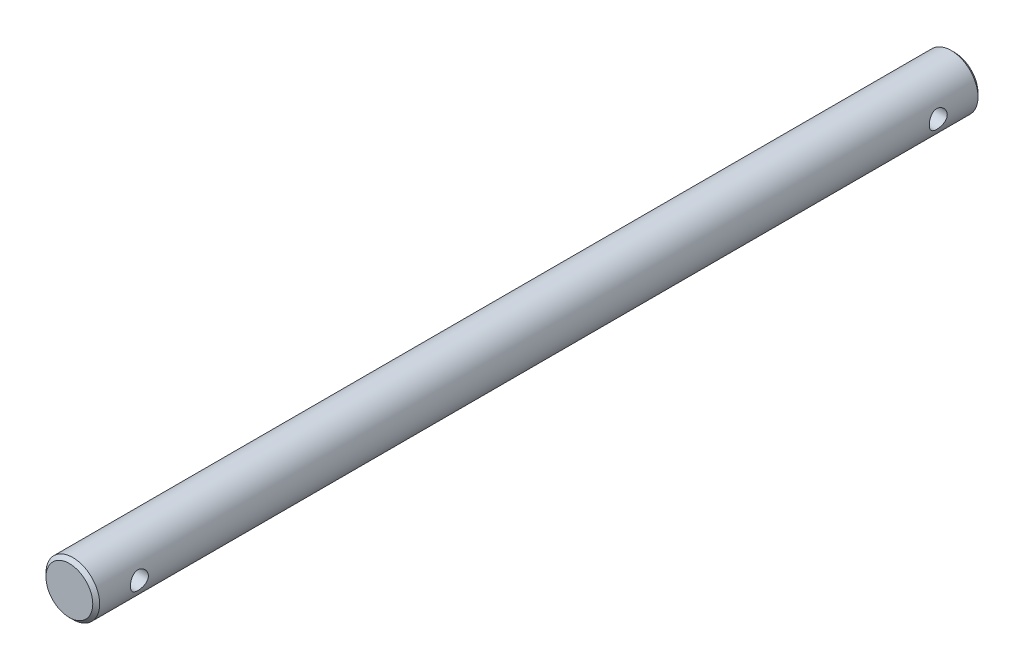
ISO-10303-21;
HEADER;
FILE_DESCRIPTION(('STEP AP214'),'2;1');
FILE_NAME('part.step','',(''),(''),'','','');
FILE_SCHEMA(('AUTOMOTIVE_DESIGN { 1 0 10303 214 1 1 1 1 }'));
ENDSEC;
DATA;
#1=APPLICATION_CONTEXT('core data for automotive mechanical design processes');
#2=APPLICATION_PROTOCOL_DEFINITION('international standard','automotive_design',2000,#1);
#3=PRODUCT_CONTEXT('',#1,'mechanical');
#4=PRODUCT('Part','Part','',(#3));
#5=PRODUCT_RELATED_PRODUCT_CATEGORY('part','',(#4));
#6=PRODUCT_DEFINITION_FORMATION('','',#4);
#7=PRODUCT_DEFINITION_CONTEXT('part definition',#1,'design');
#8=PRODUCT_DEFINITION('design','',#6,#7);
#9=PRODUCT_DEFINITION_SHAPE('','',#8);
#10=(LENGTH_UNIT() NAMED_UNIT(*) SI_UNIT(.MILLI.,.METRE.));
#11=(NAMED_UNIT(*) PLANE_ANGLE_UNIT() SI_UNIT($,.RADIAN.));
#12=(NAMED_UNIT(*) SI_UNIT($,.STERADIAN.) SOLID_ANGLE_UNIT());
#13=UNCERTAINTY_MEASURE_WITH_UNIT(LENGTH_MEASURE(1.E-05),#10,'distance_accuracy_value','');
#14=(GEOMETRIC_REPRESENTATION_CONTEXT(3) GLOBAL_UNCERTAINTY_ASSIGNED_CONTEXT((#13)) GLOBAL_UNIT_ASSIGNED_CONTEXT((#10,
#11,#12)) REPRESENTATION_CONTEXT('',''));
#15=CARTESIAN_POINT('',(0.,0.,0.));
#16=DIRECTION('',(0.,0.,1.));
#17=DIRECTION('',(1.,0.,0.));
#18=AXIS2_PLACEMENT_3D('',#15,#16,#17);
#19=CARTESIAN_POINT('',(0.,0.,130.175));
#20=DIRECTION('',(0.,0.,-1.));
#21=DIRECTION('',(-1.,0.,0.));
#22=AXIS2_PLACEMENT_3D('',#19,#20,#21);
#23=CYLINDRICAL_SURFACE('',#22,3.9497);
#24=CARTESIAN_POINT('',(0.,0.,0.507999999999981));
#25=DIRECTION('',(0.,0.,1.));
#26=DIRECTION('',(1.,0.,0.));
#27=AXIS2_PLACEMENT_3D('',#24,#25,#26);
#28=CIRCLE('',#27,3.9497);
#29=CARTESIAN_POINT('',(3.9497,0.,0.507999999999981));
#30=VERTEX_POINT('',#29);
#31=EDGE_CURVE('E59',#30,#30,#28,.T.);
#32=ORIENTED_EDGE('',*,*,#31,.T.);
#33=EDGE_LOOP('',(#32));
#34=FACE_BOUND('',#33,.T.);
#35=CARTESIAN_POINT('',(0.,0.,129.667));
#36=DIRECTION('',(0.,0.,1.));
#37=DIRECTION('',(1.,0.,0.));
#38=AXIS2_PLACEMENT_3D('',#35,#36,#37);
#39=CIRCLE('',#38,3.9497);
#40=CARTESIAN_POINT('',(3.9497,0.,129.667));
#41=VERTEX_POINT('',#40);
#42=EDGE_CURVE('E64',#41,#41,#39,.F.);
#43=ORIENTED_EDGE('',*,*,#42,.T.);
#44=EDGE_LOOP('',(#43));
#45=FACE_BOUND('',#44,.T.);
#46=CARTESIAN_POINT('',(-3.9497,0.,5.02920000000001));
#47=CARTESIAN_POINT('',(-3.94970023572746,0.072054144276923,5.02919961851002));
#48=CARTESIAN_POINT('',(-3.94771012515324,0.144105893751447,5.03511536205643));
#49=CARTESIAN_POINT('',(-3.93996728946356,0.286086346968929,5.05854905013214));
#50=CARTESIAN_POINT('',(-3.93421419769454,0.356014843133631,5.07606812525719));
#51=CARTESIAN_POINT('',(-3.9195703328747,0.491681390161255,5.12204025760679));
#52=CARTESIAN_POINT('',(-3.91068482719702,0.557426258332867,5.15047496652478));
#53=CARTESIAN_POINT('',(-3.89068254246331,0.683213708084513,5.21738802316314));
#54=CARTESIAN_POINT('',(-3.87956531893471,0.743255150246115,5.255868372049));
#55=CARTESIAN_POINT('',(-3.85583598712996,0.858022612334314,5.34318777943573));
#56=CARTESIAN_POINT('',(-3.84318790442862,0.912522573081516,5.39231412327387));
#57=CARTESIAN_POINT('',(-3.81801976816056,1.01268322368162,5.49892022003103));
#58=CARTESIAN_POINT('',(-3.8054997436145,1.05834195019826,5.55640182341797));
#59=CARTESIAN_POINT('',(-3.78160890383556,1.14081801016862,5.68012614014923));
#60=CARTESIAN_POINT('',(-3.77028189301413,1.17734086283586,5.74657443309994));
#61=CARTESIAN_POINT('',(-3.75060685993045,1.23859637341114,5.88511014847274));
#62=CARTESIAN_POINT('',(-3.74225792209178,1.26333265575986,5.95719582941652));
#63=CARTESIAN_POINT('',(-3.7298632844808,1.2994637097269,6.10238864450416));
#64=CARTESIAN_POINT('',(-3.72568131893025,1.31128227110809,6.17537834032693));
#65=CARTESIAN_POINT('',(-3.72169118443461,1.32256722231198,6.32241530895697));
#66=CARTESIAN_POINT('',(-3.72188165359827,1.32203745829228,6.39646224528212));
#67=CARTESIAN_POINT('',(-3.72649549954223,1.30896972056727,6.5398912058278));
#68=CARTESIAN_POINT('',(-3.73072362702095,1.2969856213955,6.60933106566491));
#69=CARTESIAN_POINT('',(-3.74261677527379,1.26225325040776,6.74515113993798));
#70=CARTESIAN_POINT('',(-3.75028221001851,1.23950368203896,6.81153098478014));
#71=CARTESIAN_POINT('',(-3.76832485654947,1.18352504254506,6.94060193667122));
#72=CARTESIAN_POINT('',(-3.77874393813001,1.15013236875194,7.00321598221722));
#73=CARTESIAN_POINT('',(-3.80110245809773,1.07392899910313,7.12212664107303));
#74=CARTESIAN_POINT('',(-3.81304233747339,1.03111556886332,7.17842141302842));
#75=CARTESIAN_POINT('',(-3.83786445262892,0.934628977448233,7.28620673895362));
#76=CARTESIAN_POINT('',(-3.85076323228859,0.880503266296005,7.33728920365649));
#77=CARTESIAN_POINT('',(-3.87550096981175,0.764295152530079,7.42975910769757));
#78=CARTESIAN_POINT('',(-3.88733982464714,0.702211977848416,7.47114560518729));
#79=CARTESIAN_POINT('',(-3.90878095089115,0.570981459561145,7.54338016463072));
#80=CARTESIAN_POINT('',(-3.91835957224716,0.50176944653945,7.57411824252765));
#81=CARTESIAN_POINT('',(-3.93402920331204,0.358759975134266,7.62338844971316));
#82=CARTESIAN_POINT('',(-3.94012143256369,0.284964130204454,7.64192484750063));
#83=CARTESIAN_POINT('',(-3.94792952185042,0.138336066585124,7.66554104029018));
#84=CARTESIAN_POINT('',(-3.94982458485581,0.0656020802556209,7.67117222725968));
#85=CARTESIAN_POINT('',(-3.94956268030513,-0.0797864375080367,7.67038969037274));
#86=CARTESIAN_POINT('',(-3.94740640169843,-0.152440980349658,7.66397801446088));
#87=CARTESIAN_POINT('',(-3.93940238264992,-0.29339705902848,7.63972767508434));
#88=CARTESIAN_POINT('',(-3.93366422739626,-0.361763753222684,7.62222801039887));
#89=CARTESIAN_POINT('',(-3.91918398889607,-0.494562851211421,7.57672283086352));
#90=CARTESIAN_POINT('',(-3.91044152212738,-0.558994751463589,7.5487159746525));
#91=CARTESIAN_POINT('',(-3.89055256679556,-0.683991362201224,7.48217216666886));
#92=CARTESIAN_POINT('',(-3.87934871143233,-0.744409095717058,7.4433767690421));
#93=CARTESIAN_POINT('',(-3.85580650537346,-0.858055922813714,7.35666047497734));
#94=CARTESIAN_POINT('',(-3.84346780682577,-0.911282799828044,7.30873677567992));
#95=CARTESIAN_POINT('',(-3.81833080440423,-1.01157133892019,7.20253157986906));
#96=CARTESIAN_POINT('',(-3.80553729607935,-1.0582395875738,7.14387654976048));
#97=CARTESIAN_POINT('',(-3.78151330689328,-1.1411202075197,7.01929365623377));
#98=CARTESIAN_POINT('',(-3.77028284142365,-1.17733247585382,6.95336572120948));
#99=CARTESIAN_POINT('',(-3.75076509436051,-1.23810915816149,6.81606978549451));
#100=CARTESIAN_POINT('',(-3.74247220832726,-1.26269578238923,6.74471246280727));
#101=CARTESIAN_POINT('',(-3.72989213217361,-1.29939155335385,6.59852858771818));
#102=CARTESIAN_POINT('',(-3.72560312217495,-1.31150636914852,6.52370362770771));
#103=CARTESIAN_POINT('',(-3.72172424993842,-1.32247078711078,6.37687038140417));
#104=CARTESIAN_POINT('',(-3.72190291425317,-1.32197379542939,6.3049164622097));
#105=CARTESIAN_POINT('',(-3.72636644171501,-1.30933841734009,6.1621745447977));
#106=CARTESIAN_POINT('',(-3.73065105745945,-1.297200732338,6.09138647659363));
#107=CARTESIAN_POINT('',(-3.74267083533699,-1.26209225721575,5.95434162052814));
#108=CARTESIAN_POINT('',(-3.75033802235011,-1.23933439082089,5.88802385472083));
#109=CARTESIAN_POINT('',(-3.76823356117978,-1.18380442166139,5.76009741812912));
#110=CARTESIAN_POINT('',(-3.77846248370041,-1.1510300870665,5.69848980067008));
#111=CARTESIAN_POINT('',(-3.80088833875499,-1.07472012040071,5.57880297247864));
#112=CARTESIAN_POINT('',(-3.81315191830289,-1.03077549078328,5.52099709453149));
#113=CARTESIAN_POINT('',(-3.8379873833211,-0.934062351187666,5.41336907705175));
#114=CARTESIAN_POINT('',(-3.85055935535792,-0.881291338866306,5.3635492094772));
#115=CARTESIAN_POINT('',(-3.87518853004713,-0.765931984491991,5.27133243715522));
#116=CARTESIAN_POINT('',(-3.88720605410514,-0.703039209262588,5.22930443403216));
#117=CARTESIAN_POINT('',(-3.90882795849283,-0.570685266377472,5.15646210281772));
#118=CARTESIAN_POINT('',(-3.91843293733518,-0.501225733723047,5.12564499263646));
#119=CARTESIAN_POINT('',(-3.93379823748386,-0.360746147397836,5.07734369355008));
#120=CARTESIAN_POINT('',(-3.93970477459398,-0.289918288722125,5.05934792858906));
#121=CARTESIAN_POINT('',(-3.94765499426913,-0.146059050466625,5.0352779482565));
#122=CARTESIAN_POINT('',(-3.94969976108558,-0.0730282952362207,5.02920038664762));
#123=CARTESIAN_POINT('',(-3.9497,0.,5.02920000000001));
#124=B_SPLINE_CURVE_WITH_KNOTS('',3,(#46,#47,#48,#49,#50,#51,#52,#53,#54,#55,#56,#57,#58,#59,
#60,#61,#62,#63,#64,#65,#66,#67,#68,#69,#70,#71,#72,#73,#74,#75,#76,#77,#78,#79,#80,#81,#82,#83,
#84,#85,#86,#87,#88,#89,#90,#91,#92,#93,#94,#95,#96,#97,#98,#99,#100,#101,#102,#103,#104,#105,
#106,#107,#108,#109,#110,#111,#112,#113,#114,#115,#116,#117,#118,#119,#120,#121,#122,#123),
.UNSPECIFIED.,.T.,.F.,(4,2,2,2,2,2,2,2,2,2,2,2,2,2,2,2,2,2,2,2,2,2,2,2,2,2,2,2,2,2,2,2,2,2,2,2,
2,2,4),(0.,0.21589367781877,0.431808394800712,0.647361754470617,0.862958086767456,
1.08532311075495,1.30773745793528,1.53659565305588,1.76538342742638,1.98641647833896,
2.20738068456553,2.41817364816984,2.62899200535367,2.84322140307031,3.05751306330006,
3.28306913719504,3.50864711211764,3.73649001567486,3.96425317080708,4.18208737132768,
4.39988453148769,4.6113245264927,4.82279152338062,5.03984057122586,5.2569563720717,
5.48400419103891,5.71105424562927,5.93766876130975,6.16418022386924,6.37898149303551,
6.59376982024095,6.80442558802755,7.01512832757089,7.23507395913617,7.45508205289964,
7.68374098328612,7.9123431310104,8.13121708958997,8.35002958679746),.UNSPECIFIED.);
#125=CARTESIAN_POINT('',(-3.9497,0.,5.02920000000001));
#126=VERTEX_POINT('',#125);
#127=EDGE_CURVE('E70',#126,#126,#124,.T.);
#128=ORIENTED_EDGE('',*,*,#127,.T.);
#129=EDGE_LOOP('',(#128));
#130=FACE_BOUND('',#129,.T.);
#131=CARTESIAN_POINT('',(3.9497,0.,5.02920000000001));
#132=CARTESIAN_POINT('',(3.94970023572746,-0.072054144276923,5.02919961851002));
#133=CARTESIAN_POINT('',(3.94771012515324,-0.144105893751447,5.03511536205643));
#134=CARTESIAN_POINT('',(3.93996728946355,-0.286086346968929,5.05854905013214));
#135=CARTESIAN_POINT('',(3.93421419769454,-0.356014843133631,5.07606812525719));
#136=CARTESIAN_POINT('',(3.9195703328747,-0.491681390161255,5.12204025760679));
#137=CARTESIAN_POINT('',(3.91068482719702,-0.557426258332867,5.15047496652478));
#138=CARTESIAN_POINT('',(3.89068254246331,-0.683213708084512,5.21738802316314));
#139=CARTESIAN_POINT('',(3.87956531893471,-0.743255150246115,5.255868372049));
#140=CARTESIAN_POINT('',(3.85583598712996,-0.858022612334314,5.34318777943573));
#141=CARTESIAN_POINT('',(3.84318790442862,-0.912522573081516,5.39231412327387));
#142=CARTESIAN_POINT('',(3.81801976816056,-1.01268322368162,5.49892022003103));
#143=CARTESIAN_POINT('',(3.8054997436145,-1.05834195019826,5.55640182341797));
#144=CARTESIAN_POINT('',(3.78160890383556,-1.14081801016862,5.68012614014923));
#145=CARTESIAN_POINT('',(3.77028189301413,-1.17734086283586,5.74657443309994));
#146=CARTESIAN_POINT('',(3.75060685993045,-1.23859637341114,5.88511014847274));
#147=CARTESIAN_POINT('',(3.74225792209178,-1.26333265575986,5.95719582941652));
#148=CARTESIAN_POINT('',(3.7298632844808,-1.2994637097269,6.10238864450416));
#149=CARTESIAN_POINT('',(3.72568131893025,-1.31128227110809,6.17537834032693));
#150=CARTESIAN_POINT('',(3.72169118443461,-1.32256722231198,6.32241530895697));
#151=CARTESIAN_POINT('',(3.72188165359827,-1.32203745829228,6.39646224528212));
#152=CARTESIAN_POINT('',(3.72649549954223,-1.30896972056727,6.5398912058278));
#153=CARTESIAN_POINT('',(3.73072362702095,-1.2969856213955,6.60933106566491));
#154=CARTESIAN_POINT('',(3.74261677527379,-1.26225325040776,6.74515113993798));
#155=CARTESIAN_POINT('',(3.75028221001851,-1.23950368203896,6.81153098478014));
#156=CARTESIAN_POINT('',(3.76832485654947,-1.18352504254506,6.94060193667122));
#157=CARTESIAN_POINT('',(3.77874393813001,-1.15013236875194,7.00321598221722));
#158=CARTESIAN_POINT('',(3.80110245809773,-1.07392899910313,7.12212664107303));
#159=CARTESIAN_POINT('',(3.81304233747339,-1.03111556886332,7.17842141302842));
#160=CARTESIAN_POINT('',(3.83786445262892,-0.934628977448233,7.28620673895362));
#161=CARTESIAN_POINT('',(3.85076323228859,-0.880503266296005,7.33728920365649));
#162=CARTESIAN_POINT('',(3.87550096981175,-0.764295152530079,7.42975910769757));
#163=CARTESIAN_POINT('',(3.88733982464714,-0.702211977848416,7.47114560518729));
#164=CARTESIAN_POINT('',(3.90878095089115,-0.570981459561145,7.54338016463072));
#165=CARTESIAN_POINT('',(3.91835957224716,-0.50176944653945,7.57411824252765));
#166=CARTESIAN_POINT('',(3.93402920331204,-0.358759975134266,7.62338844971316));
#167=CARTESIAN_POINT('',(3.94012143256369,-0.284964130204454,7.64192484750063));
#168=CARTESIAN_POINT('',(3.94792952185042,-0.138336066585124,7.66554104029018));
#169=CARTESIAN_POINT('',(3.94982458485581,-0.0656020802556209,7.67117222725968));
#170=CARTESIAN_POINT('',(3.94956268030513,0.0797864375080367,7.67038969037274));
#171=CARTESIAN_POINT('',(3.94740640169843,0.152440980349658,7.66397801446088));
#172=CARTESIAN_POINT('',(3.93940238264992,0.29339705902848,7.63972767508434));
#173=CARTESIAN_POINT('',(3.93366422739626,0.361763753222684,7.62222801039887));
#174=CARTESIAN_POINT('',(3.91918398889607,0.494562851211421,7.57672283086352));
#175=CARTESIAN_POINT('',(3.91044152212738,0.558994751463589,7.5487159746525));
#176=CARTESIAN_POINT('',(3.89055256679556,0.683991362201224,7.48217216666886));
#177=CARTESIAN_POINT('',(3.87934871143233,0.744409095717058,7.4433767690421));
#178=CARTESIAN_POINT('',(3.85580650537346,0.858055922813714,7.35666047497734));
#179=CARTESIAN_POINT('',(3.84346780682577,0.911282799828044,7.30873677567992));
#180=CARTESIAN_POINT('',(3.81833080440423,1.01157133892019,7.20253157986906));
#181=CARTESIAN_POINT('',(3.80553729607935,1.0582395875738,7.14387654976048));
#182=CARTESIAN_POINT('',(3.78151330689328,1.1411202075197,7.01929365623377));
#183=CARTESIAN_POINT('',(3.77028284142365,1.17733247585382,6.95336572120948));
#184=CARTESIAN_POINT('',(3.75076509436051,1.23810915816149,6.81606978549451));
#185=CARTESIAN_POINT('',(3.74247220832726,1.26269578238923,6.74471246280727));
#186=CARTESIAN_POINT('',(3.72989213217361,1.29939155335385,6.59852858771818));
#187=CARTESIAN_POINT('',(3.72560312217495,1.31150636914852,6.52370362770771));
#188=CARTESIAN_POINT('',(3.72172424993842,1.32247078711078,6.37687038140417));
#189=CARTESIAN_POINT('',(3.72190291425317,1.32197379542939,6.3049164622097));
#190=CARTESIAN_POINT('',(3.72636644171501,1.30933841734009,6.1621745447977));
#191=CARTESIAN_POINT('',(3.73065105745945,1.297200732338,6.09138647659363));
#192=CARTESIAN_POINT('',(3.74267083533699,1.26209225721575,5.95434162052814));
#193=CARTESIAN_POINT('',(3.75033802235011,1.23933439082089,5.88802385472083));
#194=CARTESIAN_POINT('',(3.76823356117978,1.18380442166139,5.76009741812912));
#195=CARTESIAN_POINT('',(3.77846248370041,1.1510300870665,5.69848980067008));
#196=CARTESIAN_POINT('',(3.80088833875499,1.07472012040071,5.57880297247864));
#197=CARTESIAN_POINT('',(3.81315191830289,1.03077549078328,5.52099709453149));
#198=CARTESIAN_POINT('',(3.8379873833211,0.934062351187666,5.41336907705175));
#199=CARTESIAN_POINT('',(3.85055935535792,0.881291338866306,5.3635492094772));
#200=CARTESIAN_POINT('',(3.87518853004713,0.765931984491991,5.27133243715522));
#201=CARTESIAN_POINT('',(3.88720605410514,0.703039209262588,5.22930443403216));
#202=CARTESIAN_POINT('',(3.90882795849283,0.570685266377471,5.15646210281772));
#203=CARTESIAN_POINT('',(3.91843293733518,0.501225733723047,5.12564499263646));
#204=CARTESIAN_POINT('',(3.93379823748386,0.360746147397835,5.07734369355008));
#205=CARTESIAN_POINT('',(3.93970477459398,0.289918288722125,5.05934792858906));
#206=CARTESIAN_POINT('',(3.94765499426913,0.146059050466625,5.0352779482565));
#207=CARTESIAN_POINT('',(3.94969976108558,0.0730282952362207,5.02920038664762));
#208=CARTESIAN_POINT('',(3.9497,0.,5.02920000000001));
#209=B_SPLINE_CURVE_WITH_KNOTS('',3,(#131,#132,#133,#134,#135,#136,#137,#138,#139,#140,#141,
#142,#143,#144,#145,#146,#147,#148,#149,#150,#151,#152,#153,#154,#155,#156,#157,#158,#159,#160,
#161,#162,#163,#164,#165,#166,#167,#168,#169,#170,#171,#172,#173,#174,#175,#176,#177,#178,#179,
#180,#181,#182,#183,#184,#185,#186,#187,#188,#189,#190,#191,#192,#193,#194,#195,#196,#197,#198,
#199,#200,#201,#202,#203,#204,#205,#206,#207,#208),.UNSPECIFIED.,.T.,.F.,(4,2,2,2,2,2,2,2,2,2,2,
2,2,2,2,2,2,2,2,2,2,2,2,2,2,2,2,2,2,2,2,2,2,2,2,2,2,2,4),(0.,0.21589367781877,0.431808394800712,
0.647361754470617,0.862958086767456,1.08532311075495,1.30773745793528,1.53659565305588,
1.76538342742638,1.98641647833896,2.20738068456553,2.41817364816984,2.62899200535367,
2.84322140307031,3.05751306330006,3.28306913719504,3.50864711211764,3.73649001567486,
3.96425317080708,4.18208737132768,4.39988453148769,4.6113245264927,4.82279152338062,
5.03984057122586,5.2569563720717,5.48400419103891,5.71105424562927,5.93766876130975,
6.16418022386924,6.37898149303551,6.59376982024095,6.80442558802755,7.01512832757089,
7.23507395913617,7.45508205289964,7.68374098328612,7.9123431310104,8.13121708958997,
8.35002958679746),.UNSPECIFIED.);
#210=CARTESIAN_POINT('',(3.9497,0.,5.02920000000001));
#211=VERTEX_POINT('',#210);
#212=EDGE_CURVE('E79',#211,#211,#209,.T.);
#213=ORIENTED_EDGE('',*,*,#212,.T.);
#214=EDGE_LOOP('',(#213));
#215=FACE_BOUND('',#214,.T.);
#216=CARTESIAN_POINT('',(-3.9497,0.,122.5042));
#217=CARTESIAN_POINT('',(-3.94970023572746,0.0720541442769228,122.50419961851));
#218=CARTESIAN_POINT('',(-3.94771012515324,0.144105893751447,122.510115362056));
#219=CARTESIAN_POINT('',(-3.93996728946356,0.286086346968928,122.533549050132));
#220=CARTESIAN_POINT('',(-3.93421419769454,0.356014843133629,122.551068125257));
#221=CARTESIAN_POINT('',(-3.9195703328747,0.491681390161254,122.597040257607));
#222=CARTESIAN_POINT('',(-3.91068482719702,0.557426258332866,122.625474966525));
#223=CARTESIAN_POINT('',(-3.89068254246331,0.683213708084512,122.692388023163));
#224=CARTESIAN_POINT('',(-3.87956531893471,0.743255150246114,122.730868372049));
#225=CARTESIAN_POINT('',(-3.85583598712996,0.858022612334313,122.818187779436));
#226=CARTESIAN_POINT('',(-3.84318790442862,0.912522573081516,122.867314123274));
#227=CARTESIAN_POINT('',(-3.81801976816056,1.01268322368163,122.973920220031));
#228=CARTESIAN_POINT('',(-3.8054997436145,1.05834195019826,123.031401823418));
#229=CARTESIAN_POINT('',(-3.78160890383556,1.14081801016862,123.155126140149));
#230=CARTESIAN_POINT('',(-3.77028189301413,1.17734086283586,123.2215744331));
#231=CARTESIAN_POINT('',(-3.75060685993045,1.23859637341114,123.360110148473));
#232=CARTESIAN_POINT('',(-3.74225792209178,1.26333265575986,123.432195829417));
#233=CARTESIAN_POINT('',(-3.7298632844808,1.2994637097269,123.577388644504));
#234=CARTESIAN_POINT('',(-3.72568131893025,1.31128227110809,123.650378340327));
#235=CARTESIAN_POINT('',(-3.72169118443461,1.32256722231198,123.797415308957));
#236=CARTESIAN_POINT('',(-3.72188165359827,1.32203745829228,123.871462245282));
#237=CARTESIAN_POINT('',(-3.72649549954223,1.30896972056727,124.014891205828));
#238=CARTESIAN_POINT('',(-3.73072362702095,1.2969856213955,124.084331065665));
#239=CARTESIAN_POINT('',(-3.74261677527379,1.26225325040776,124.220151139938));
#240=CARTESIAN_POINT('',(-3.75028221001851,1.23950368203897,124.28653098478));
#241=CARTESIAN_POINT('',(-3.76832485654947,1.18352504254507,124.415601936671));
#242=CARTESIAN_POINT('',(-3.77874393813,1.15013236875195,124.478215982217));
#243=CARTESIAN_POINT('',(-3.80110245809773,1.07392899910313,124.597126641073));
#244=CARTESIAN_POINT('',(-3.81304233747339,1.03111556886333,124.653421413028));
#245=CARTESIAN_POINT('',(-3.83786445262892,0.934628977448234,124.761206738954));
#246=CARTESIAN_POINT('',(-3.85076323228859,0.880503266296006,124.812289203656));
#247=CARTESIAN_POINT('',(-3.87550096981175,0.764295152530074,124.904759107698));
#248=CARTESIAN_POINT('',(-3.88733982464714,0.702211977848408,124.946145605187));
#249=CARTESIAN_POINT('',(-3.90878095089115,0.570981459561134,125.018380164631));
#250=CARTESIAN_POINT('',(-3.91835957224716,0.50176944653944,125.049118242528));
#251=CARTESIAN_POINT('',(-3.93402920331204,0.358759975134257,125.098388449713));
#252=CARTESIAN_POINT('',(-3.94012143256369,0.284964130204443,125.116924847501));
#253=CARTESIAN_POINT('',(-3.94792952185042,0.138336066585114,125.14054104029));
#254=CARTESIAN_POINT('',(-3.94982458485581,0.065602080255612,125.14617222726));
#255=CARTESIAN_POINT('',(-3.94956268030513,-0.0797864375080426,125.145389690373));
#256=CARTESIAN_POINT('',(-3.94740640169843,-0.152440980349662,125.138978014461));
#257=CARTESIAN_POINT('',(-3.93940238264992,-0.293397059028486,125.114727675084));
#258=CARTESIAN_POINT('',(-3.93366422739626,-0.361763753222693,125.097228010399));
#259=CARTESIAN_POINT('',(-3.91918398889607,-0.49456285121143,125.051722830864));
#260=CARTESIAN_POINT('',(-3.91044152212738,-0.558994751463593,125.023715974653));
#261=CARTESIAN_POINT('',(-3.89055256679556,-0.683991362201225,124.957172166669));
#262=CARTESIAN_POINT('',(-3.87934871143233,-0.74440909571706,124.918376769042));
#263=CARTESIAN_POINT('',(-3.85580650537346,-0.858055922813717,124.831660474977));
#264=CARTESIAN_POINT('',(-3.84346780682577,-0.911282799828044,124.78373677568));
#265=CARTESIAN_POINT('',(-3.81833080440423,-1.01157133892019,124.677531579869));
#266=CARTESIAN_POINT('',(-3.80553729607935,-1.0582395875738,124.61887654976));
#267=CARTESIAN_POINT('',(-3.78151330689328,-1.1411202075197,124.494293656234));
#268=CARTESIAN_POINT('',(-3.77028284142365,-1.17733247585382,124.428365721209));
#269=CARTESIAN_POINT('',(-3.75076509436051,-1.23810915816149,124.291069785494));
#270=CARTESIAN_POINT('',(-3.74247220832726,-1.26269578238923,124.219712462807));
#271=CARTESIAN_POINT('',(-3.72989213217361,-1.29939155335386,124.073528587718));
#272=CARTESIAN_POINT('',(-3.72560312217495,-1.31150636914852,123.998703627708));
#273=CARTESIAN_POINT('',(-3.72172424993843,-1.32247078711078,123.851870381404));
#274=CARTESIAN_POINT('',(-3.72190291425317,-1.32197379542939,123.77991646221));
#275=CARTESIAN_POINT('',(-3.72636644171501,-1.30933841734009,123.637174544798));
#276=CARTESIAN_POINT('',(-3.73065105745945,-1.29720073233799,123.566386476594));
#277=CARTESIAN_POINT('',(-3.74267083533699,-1.26209225721575,123.429341620528));
#278=CARTESIAN_POINT('',(-3.75033802235012,-1.23933439082089,123.363023854721));
#279=CARTESIAN_POINT('',(-3.76823356117978,-1.18380442166139,123.235097418129));
#280=CARTESIAN_POINT('',(-3.77846248370041,-1.1510300870665,123.17348980067));
#281=CARTESIAN_POINT('',(-3.80088833875499,-1.07472012040071,123.053802972479));
#282=CARTESIAN_POINT('',(-3.81315191830289,-1.03077549078328,122.995997094531));
#283=CARTESIAN_POINT('',(-3.8379873833211,-0.934062351187663,122.888369077052));
#284=CARTESIAN_POINT('',(-3.85055935535792,-0.881291338866302,122.838549209477));
#285=CARTESIAN_POINT('',(-3.87518853004713,-0.765931984491986,122.746332437155));
#286=CARTESIAN_POINT('',(-3.88720605410514,-0.703039209262583,122.704304434032));
#287=CARTESIAN_POINT('',(-3.90882795849283,-0.570685266377468,122.631462102818));
#288=CARTESIAN_POINT('',(-3.91843293733518,-0.501225733723044,122.600644992636));
#289=CARTESIAN_POINT('',(-3.93379823748386,-0.360746147397833,122.55234369355));
#290=CARTESIAN_POINT('',(-3.93970477459398,-0.289918288722122,122.534347928589));
#291=CARTESIAN_POINT('',(-3.94765499426913,-0.146059050466623,122.510277948256));
#292=CARTESIAN_POINT('',(-3.94969976108558,-0.0730282952362201,122.504200386648));
#293=CARTESIAN_POINT('',(-3.9497,0.,122.5042));
#294=B_SPLINE_CURVE_WITH_KNOTS('',3,(#216,#217,#218,#219,#220,#221,#222,#223,#224,#225,#226,
#227,#228,#229,#230,#231,#232,#233,#234,#235,#236,#237,#238,#239,#240,#241,#242,#243,#244,#245,
#246,#247,#248,#249,#250,#251,#252,#253,#254,#255,#256,#257,#258,#259,#260,#261,#262,#263,#264,
#265,#266,#267,#268,#269,#270,#271,#272,#273,#274,#275,#276,#277,#278,#279,#280,#281,#282,#283,
#284,#285,#286,#287,#288,#289,#290,#291,#292,#293),.UNSPECIFIED.,.T.,.F.,(4,2,2,2,2,2,2,2,2,2,2,
2,2,2,2,2,2,2,2,2,2,2,2,2,2,2,2,2,2,2,2,2,2,2,2,2,2,2,4),(0.,0.215893677818768,
0.431808394800715,0.647361754470613,0.862958086767455,1.08532311075495,1.30773745793529,
1.53659565305589,1.76538342742638,1.98641647833897,2.20738068456554,2.41817364816983,
2.62899200535366,2.8432214030703,3.05751306330005,3.28306913719505,3.50864711211765,
3.73649001567488,3.9642531708071,4.18208737132769,4.3998845314877,4.61132452649271,
4.82279152338063,5.03984057122587,5.2569563720717,5.48400419103891,5.71105424562926,
5.93766876130979,6.16418022386925,6.37898149303552,6.59376982024095,6.80442558802755,
7.01512832757089,7.23507395913618,7.45508205289966,7.68374098328613,7.91234313101041,
8.13121708958997,8.35002958679746),.UNSPECIFIED.);
#295=CARTESIAN_POINT('',(-3.9497,0.,122.5042));
#296=VERTEX_POINT('',#295);
#297=EDGE_CURVE('E106',#296,#296,#294,.T.);
#298=ORIENTED_EDGE('',*,*,#297,.T.);
#299=EDGE_LOOP('',(#298));
#300=FACE_BOUND('',#299,.T.);
#301=CARTESIAN_POINT('',(3.9497,0.,122.5042));
#302=CARTESIAN_POINT('',(3.94970023572746,-0.0720541442769227,122.50419961851));
#303=CARTESIAN_POINT('',(3.94771012515324,-0.144105893751447,122.510115362056));
#304=CARTESIAN_POINT('',(3.93996728946355,-0.286086346968928,122.533549050132));
#305=CARTESIAN_POINT('',(3.93421419769454,-0.356014843133629,122.551068125257));
#306=CARTESIAN_POINT('',(3.9195703328747,-0.491681390161254,122.597040257607));
#307=CARTESIAN_POINT('',(3.91068482719702,-0.557426258332866,122.625474966525));
#308=CARTESIAN_POINT('',(3.89068254246331,-0.683213708084512,122.692388023163));
#309=CARTESIAN_POINT('',(3.87956531893471,-0.743255150246114,122.730868372049));
#310=CARTESIAN_POINT('',(3.85583598712996,-0.858022612334313,122.818187779436));
#311=CARTESIAN_POINT('',(3.84318790442862,-0.912522573081516,122.867314123274));
#312=CARTESIAN_POINT('',(3.81801976816056,-1.01268322368163,122.973920220031));
#313=CARTESIAN_POINT('',(3.8054997436145,-1.05834195019826,123.031401823418));
#314=CARTESIAN_POINT('',(3.78160890383556,-1.14081801016862,123.155126140149));
#315=CARTESIAN_POINT('',(3.77028189301413,-1.17734086283586,123.2215744331));
#316=CARTESIAN_POINT('',(3.75060685993045,-1.23859637341114,123.360110148473));
#317=CARTESIAN_POINT('',(3.74225792209178,-1.26333265575986,123.432195829417));
#318=CARTESIAN_POINT('',(3.7298632844808,-1.2994637097269,123.577388644504));
#319=CARTESIAN_POINT('',(3.72568131893025,-1.31128227110809,123.650378340327));
#320=CARTESIAN_POINT('',(3.72169118443461,-1.32256722231198,123.797415308957));
#321=CARTESIAN_POINT('',(3.72188165359827,-1.32203745829228,123.871462245282));
#322=CARTESIAN_POINT('',(3.72649549954223,-1.30896972056727,124.014891205828));
#323=CARTESIAN_POINT('',(3.73072362702095,-1.2969856213955,124.084331065665));
#324=CARTESIAN_POINT('',(3.74261677527379,-1.26225325040776,124.220151139938));
#325=CARTESIAN_POINT('',(3.75028221001851,-1.23950368203897,124.28653098478));
#326=CARTESIAN_POINT('',(3.76832485654947,-1.18352504254507,124.415601936671));
#327=CARTESIAN_POINT('',(3.77874393813,-1.15013236875195,124.478215982217));
#328=CARTESIAN_POINT('',(3.80110245809773,-1.07392899910313,124.597126641073));
#329=CARTESIAN_POINT('',(3.81304233747339,-1.03111556886333,124.653421413028));
#330=CARTESIAN_POINT('',(3.83786445262892,-0.934628977448234,124.761206738954));
#331=CARTESIAN_POINT('',(3.85076323228859,-0.880503266296006,124.812289203656));
#332=CARTESIAN_POINT('',(3.87550096981175,-0.764295152530074,124.904759107698));
#333=CARTESIAN_POINT('',(3.88733982464714,-0.702211977848408,124.946145605187));
#334=CARTESIAN_POINT('',(3.90878095089115,-0.570981459561134,125.018380164631));
#335=CARTESIAN_POINT('',(3.91835957224716,-0.50176944653944,125.049118242528));
#336=CARTESIAN_POINT('',(3.93402920331204,-0.358759975134257,125.098388449713));
#337=CARTESIAN_POINT('',(3.94012143256369,-0.284964130204443,125.116924847501));
#338=CARTESIAN_POINT('',(3.94792952185042,-0.138336066585114,125.14054104029));
#339=CARTESIAN_POINT('',(3.94982458485581,-0.065602080255612,125.14617222726));
#340=CARTESIAN_POINT('',(3.94956268030513,0.0797864375080426,125.145389690373));
#341=CARTESIAN_POINT('',(3.94740640169843,0.152440980349662,125.138978014461));
#342=CARTESIAN_POINT('',(3.93940238264992,0.293397059028486,125.114727675084));
#343=CARTESIAN_POINT('',(3.93366422739626,0.361763753222693,125.097228010399));
#344=CARTESIAN_POINT('',(3.91918398889607,0.49456285121143,125.051722830864));
#345=CARTESIAN_POINT('',(3.91044152212738,0.558994751463593,125.023715974653));
#346=CARTESIAN_POINT('',(3.89055256679556,0.683991362201225,124.957172166669));
#347=CARTESIAN_POINT('',(3.87934871143233,0.74440909571706,124.918376769042));
#348=CARTESIAN_POINT('',(3.85580650537346,0.858055922813717,124.831660474977));
#349=CARTESIAN_POINT('',(3.84346780682577,0.911282799828044,124.78373677568));
#350=CARTESIAN_POINT('',(3.81833080440423,1.01157133892019,124.677531579869));
#351=CARTESIAN_POINT('',(3.80553729607935,1.0582395875738,124.61887654976));
#352=CARTESIAN_POINT('',(3.78151330689328,1.1411202075197,124.494293656234));
#353=CARTESIAN_POINT('',(3.77028284142365,1.17733247585382,124.428365721209));
#354=CARTESIAN_POINT('',(3.75076509436051,1.23810915816149,124.291069785494));
#355=CARTESIAN_POINT('',(3.74247220832726,1.26269578238923,124.219712462807));
#356=CARTESIAN_POINT('',(3.72989213217361,1.29939155335386,124.073528587718));
#357=CARTESIAN_POINT('',(3.72560312217495,1.31150636914852,123.998703627708));
#358=CARTESIAN_POINT('',(3.72172424993843,1.32247078711078,123.851870381404));
#359=CARTESIAN_POINT('',(3.72190291425317,1.32197379542939,123.77991646221));
#360=CARTESIAN_POINT('',(3.72636644171501,1.30933841734009,123.637174544798));
#361=CARTESIAN_POINT('',(3.73065105745945,1.29720073233799,123.566386476594));
#362=CARTESIAN_POINT('',(3.74267083533699,1.26209225721575,123.429341620528));
#363=CARTESIAN_POINT('',(3.75033802235012,1.23933439082089,123.363023854721));
#364=CARTESIAN_POINT('',(3.76823356117978,1.18380442166139,123.235097418129));
#365=CARTESIAN_POINT('',(3.77846248370041,1.1510300870665,123.17348980067));
#366=CARTESIAN_POINT('',(3.80088833875499,1.07472012040071,123.053802972479));
#367=CARTESIAN_POINT('',(3.81315191830289,1.03077549078328,122.995997094531));
#368=CARTESIAN_POINT('',(3.8379873833211,0.934062351187663,122.888369077052));
#369=CARTESIAN_POINT('',(3.85055935535792,0.881291338866302,122.838549209477));
#370=CARTESIAN_POINT('',(3.87518853004713,0.765931984491986,122.746332437155));
#371=CARTESIAN_POINT('',(3.88720605410514,0.703039209262583,122.704304434032));
#372=CARTESIAN_POINT('',(3.90882795849283,0.570685266377468,122.631462102818));
#373=CARTESIAN_POINT('',(3.91843293733518,0.501225733723044,122.600644992636));
#374=CARTESIAN_POINT('',(3.93379823748386,0.360746147397833,122.55234369355));
#375=CARTESIAN_POINT('',(3.93970477459398,0.289918288722122,122.534347928589));
#376=CARTESIAN_POINT('',(3.94765499426913,0.146059050466623,122.510277948256));
#377=CARTESIAN_POINT('',(3.94969976108558,0.0730282952362201,122.504200386648));
#378=CARTESIAN_POINT('',(3.9497,0.,122.5042));
#379=B_SPLINE_CURVE_WITH_KNOTS('',3,(#301,#302,#303,#304,#305,#306,#307,#308,#309,#310,#311,
#312,#313,#314,#315,#316,#317,#318,#319,#320,#321,#322,#323,#324,#325,#326,#327,#328,#329,#330,
#331,#332,#333,#334,#335,#336,#337,#338,#339,#340,#341,#342,#343,#344,#345,#346,#347,#348,#349,
#350,#351,#352,#353,#354,#355,#356,#357,#358,#359,#360,#361,#362,#363,#364,#365,#366,#367,#368,
#369,#370,#371,#372,#373,#374,#375,#376,#377,#378),.UNSPECIFIED.,.T.,.F.,(4,2,2,2,2,2,2,2,2,2,2,
2,2,2,2,2,2,2,2,2,2,2,2,2,2,2,2,2,2,2,2,2,2,2,2,2,2,2,4),(0.,0.215893677818768,
0.431808394800715,0.647361754470613,0.862958086767455,1.08532311075495,1.30773745793529,
1.53659565305589,1.76538342742638,1.98641647833897,2.20738068456554,2.41817364816983,
2.62899200535366,2.8432214030703,3.05751306330005,3.28306913719505,3.50864711211765,
3.73649001567488,3.9642531708071,4.18208737132769,4.3998845314877,4.61132452649271,
4.82279152338063,5.03984057122587,5.2569563720717,5.48400419103891,5.71105424562926,
5.93766876130979,6.16418022386925,6.37898149303552,6.59376982024095,6.80442558802755,
7.01512832757089,7.23507395913618,7.45508205289966,7.68374098328613,7.91234313101041,
8.13121708958998,8.35002958679747),.UNSPECIFIED.);
#380=CARTESIAN_POINT('',(3.9497,0.,122.5042));
#381=VERTEX_POINT('',#380);
#382=EDGE_CURVE('E102',#381,#381,#379,.T.);
#383=ORIENTED_EDGE('',*,*,#382,.T.);
#384=EDGE_LOOP('',(#383));
#385=FACE_BOUND('',#384,.T.);
#386=ADVANCED_FACE('F45',(#34,#45,#130,#215,#300,#385),#23,.T.);
#387=CARTESIAN_POINT('',(0.,0.,130.175));
#388=DIRECTION('',(0.,0.,1.));
#389=DIRECTION('',(1.,0.,0.));
#390=AXIS2_PLACEMENT_3D('',#387,#388,#389);
#391=PLANE('',#390);
#392=CARTESIAN_POINT('',(0.,0.,130.175));
#393=DIRECTION('',(0.,0.,1.));
#394=DIRECTION('',(1.,0.,0.));
#395=AXIS2_PLACEMENT_3D('',#392,#393,#394);
#396=CIRCLE('',#395,3.44169999999998);
#397=CARTESIAN_POINT('',(3.44169999999998,0.,130.175));
#398=VERTEX_POINT('',#397);
#399=EDGE_CURVE('E10',#398,#398,#396,.T.);
#400=ORIENTED_EDGE('',*,*,#399,.T.);
#401=EDGE_LOOP('',(#400));
#402=FACE_BOUND('',#401,.T.);
#403=ADVANCED_FACE('F99',(#402),#391,.T.);
#404=CARTESIAN_POINT('',(0.,0.,0.));
#405=DIRECTION('',(0.,0.,1.));
#406=DIRECTION('',(1.,0.,0.));
#407=AXIS2_PLACEMENT_3D('',#404,#405,#406);
#408=PLANE('',#407);
#409=CARTESIAN_POINT('',(0.,0.,0.));
#410=DIRECTION('',(0.,0.,1.));
#411=DIRECTION('',(1.,0.,0.));
#412=AXIS2_PLACEMENT_3D('',#409,#410,#411);
#413=CIRCLE('',#412,3.44170000000002);
#414=CARTESIAN_POINT('',(3.44170000000002,0.,0.));
#415=VERTEX_POINT('',#414);
#416=EDGE_CURVE('E54',#415,#415,#413,.F.);
#417=ORIENTED_EDGE('',*,*,#416,.T.);
#418=EDGE_LOOP('',(#417));
#419=FACE_BOUND('',#418,.T.);
#420=ADVANCED_FACE('F97',(#419),#408,.F.);
#421=CARTESIAN_POINT('',(3.9497,0.,123.825));
#422=DIRECTION('',(1.,0.,0.));
#423=DIRECTION('',(0.,0.,-1.));
#424=AXIS2_PLACEMENT_3D('',#421,#422,#423);
#425=CYLINDRICAL_SURFACE('',#424,1.32079999999999);
#426=ORIENTED_EDGE('',*,*,#382,.F.);
#427=EDGE_LOOP('',(#426));
#428=FACE_BOUND('',#427,.T.);
#429=ORIENTED_EDGE('',*,*,#297,.F.);
#430=EDGE_LOOP('',(#429));
#431=FACE_BOUND('',#430,.T.);
#432=ADVANCED_FACE('F91',(#428,#431),#425,.F.);
#433=CARTESIAN_POINT('',(3.9497,0.,6.35));
#434=DIRECTION('',(1.,0.,0.));
#435=DIRECTION('',(0.,0.,-1.));
#436=AXIS2_PLACEMENT_3D('',#433,#434,#435);
#437=CYLINDRICAL_SURFACE('',#436,1.32079999999999);
#438=ORIENTED_EDGE('',*,*,#212,.F.);
#439=EDGE_LOOP('',(#438));
#440=FACE_BOUND('',#439,.T.);
#441=ORIENTED_EDGE('',*,*,#127,.F.);
#442=EDGE_LOOP('',(#441));
#443=FACE_BOUND('',#442,.T.);
#444=ADVANCED_FACE('F86',(#440,#443),#437,.F.);
#445=CARTESIAN_POINT('',(0.,0.,0.507999999999981));
#446=DIRECTION('',(0.,0.,1.));
#447=DIRECTION('',(1.,0.,0.));
#448=AXIS2_PLACEMENT_3D('',#445,#446,#447);
#449=CONICAL_SURFACE('',#448,3.9497,0.785398163397447);
#450=ORIENTED_EDGE('',*,*,#416,.F.);
#451=EDGE_LOOP('',(#450));
#452=FACE_BOUND('',#451,.T.);
#453=ORIENTED_EDGE('',*,*,#31,.F.);
#454=EDGE_LOOP('',(#453));
#455=FACE_BOUND('',#454,.T.);
#456=ADVANCED_FACE('F90',(#452,#455),#449,.T.);
#457=CARTESIAN_POINT('',(0.,0.,130.175));
#458=DIRECTION('',(0.,0.,-1.));
#459=DIRECTION('',(-1.,0.,0.));
#460=AXIS2_PLACEMENT_3D('',#457,#458,#459);
#461=CONICAL_SURFACE('',#460,3.44169999999998,0.785398163397461);
#462=ORIENTED_EDGE('',*,*,#42,.F.);
#463=EDGE_LOOP('',(#462));
#464=FACE_BOUND('',#463,.T.);
#465=ORIENTED_EDGE('',*,*,#399,.F.);
#466=EDGE_LOOP('',(#465));
#467=FACE_BOUND('',#466,.T.);
#468=ADVANCED_FACE('F48',(#464,#467),#461,.T.);
#469=CLOSED_SHELL('',(#386,#403,#420,#432,#444,#456,#468));
#470=MANIFOLD_SOLID_BREP('B2',#469);
#471=ADVANCED_BREP_SHAPE_REPRESENTATION('',(#18,#470),#14);
#472=SHAPE_DEFINITION_REPRESENTATION(#9,#471);
ENDSEC;
END-ISO-10303-21;
